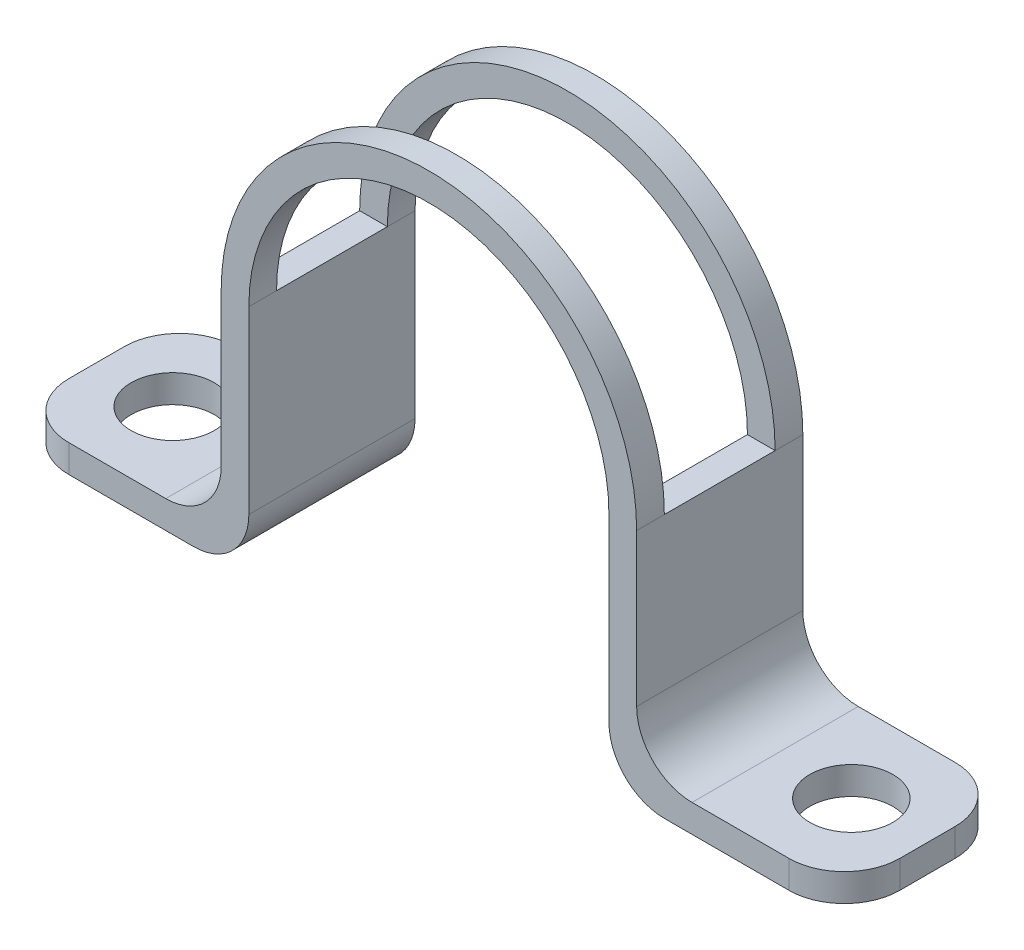
ISO-10303-21;
HEADER;
FILE_DESCRIPTION(('STEP AP214'),'2;1');
FILE_NAME('part.step','',(''),(''),'','','');
FILE_SCHEMA(('AUTOMOTIVE_DESIGN { 1 0 10303 214 1 1 1 1 }'));
ENDSEC;
DATA;
#1=APPLICATION_CONTEXT('core data for automotive mechanical design processes');
#2=APPLICATION_PROTOCOL_DEFINITION('international standard','automotive_design',2000,#1);
#3=PRODUCT_CONTEXT('',#1,'mechanical');
#4=PRODUCT('Part','Part','',(#3));
#5=PRODUCT_RELATED_PRODUCT_CATEGORY('part','',(#4));
#6=PRODUCT_DEFINITION_FORMATION('','',#4);
#7=PRODUCT_DEFINITION_CONTEXT('part definition',#1,'design');
#8=PRODUCT_DEFINITION('design','',#6,#7);
#9=PRODUCT_DEFINITION_SHAPE('','',#8);
#10=(LENGTH_UNIT() NAMED_UNIT(*) SI_UNIT(.MILLI.,.METRE.));
#11=(NAMED_UNIT(*) PLANE_ANGLE_UNIT() SI_UNIT($,.RADIAN.));
#12=(NAMED_UNIT(*) SI_UNIT($,.STERADIAN.) SOLID_ANGLE_UNIT());
#13=UNCERTAINTY_MEASURE_WITH_UNIT(LENGTH_MEASURE(1.E-05),#10,'distance_accuracy_value','');
#14=(GEOMETRIC_REPRESENTATION_CONTEXT(3) GLOBAL_UNCERTAINTY_ASSIGNED_CONTEXT((#13)) GLOBAL_UNIT_ASSIGNED_CONTEXT((#10,
#11,#12)) REPRESENTATION_CONTEXT('',''));
#15=CARTESIAN_POINT('',(0.,0.,0.));
#16=DIRECTION('',(0.,0.,1.));
#17=DIRECTION('',(1.,0.,0.));
#18=AXIS2_PLACEMENT_3D('',#15,#16,#17);
#19=CARTESIAN_POINT('',(0.,7.5,6.));
#20=DIRECTION('',(0.,0.,-1.));
#21=DIRECTION('',(-1.,0.,0.));
#22=AXIS2_PLACEMENT_3D('',#19,#20,#21);
#23=CYLINDRICAL_SURFACE('',#22,6.5);
#24=CARTESIAN_POINT('',(0.,7.5,5.));
#25=DIRECTION('',(0.,0.,-1.));
#26=DIRECTION('',(0.,1.,0.));
#27=AXIS2_PLACEMENT_3D('',#24,#25,#26);
#28=CIRCLE('',#27,6.5);
#29=CARTESIAN_POINT('',(6.5,7.5,5.));
#30=VERTEX_POINT('',#29);
#31=CARTESIAN_POINT('',(-6.5,7.5,5.));
#32=VERTEX_POINT('',#31);
#33=EDGE_CURVE('E489',#30,#32,#28,.F.);
#34=ORIENTED_EDGE('',*,*,#33,.F.);
#35=DIRECTION('',(0.,0.,-1.));
#36=VECTOR('',#35,1.);
#37=CARTESIAN_POINT('',(6.5,7.5,6.));
#38=LINE('',#37,#36);
#39=CARTESIAN_POINT('',(6.5,7.5,6.));
#40=VERTEX_POINT('',#39);
#41=EDGE_CURVE('E270',#40,#30,#38,.T.);
#42=ORIENTED_EDGE('',*,*,#41,.F.);
#43=CARTESIAN_POINT('',(0.,7.5,6.));
#44=DIRECTION('',(0.,0.,-1.));
#45=DIRECTION('',(1.,0.,0.));
#46=AXIS2_PLACEMENT_3D('',#43,#44,#45);
#47=CIRCLE('',#46,6.5);
#48=CARTESIAN_POINT('',(-6.5,7.5,6.));
#49=VERTEX_POINT('',#48);
#50=EDGE_CURVE('E470',#49,#40,#47,.T.);
#51=ORIENTED_EDGE('',*,*,#50,.F.);
#52=DIRECTION('',(0.,0.,-1.));
#53=VECTOR('',#52,1.);
#54=CARTESIAN_POINT('',(-6.5,7.5,6.));
#55=LINE('',#54,#53);
#56=EDGE_CURVE('E275',#49,#32,#55,.T.);
#57=ORIENTED_EDGE('',*,*,#56,.T.);
#58=EDGE_LOOP('',(#34,#42,#51,#57));
#59=FACE_BOUND('',#58,.T.);
#60=ADVANCED_FACE('F38',(#59),#23,.F.);
#61=CARTESIAN_POINT('',(0.,7.5,0.999999999999999));
#62=DIRECTION('',(0.,0.,1.));
#63=DIRECTION('',(1.,0.,0.));
#64=AXIS2_PLACEMENT_3D('',#61,#62,#63);
#65=CIRCLE('',#64,6.5);
#66=CARTESIAN_POINT('',(-6.5,7.5,0.999999999999999));
#67=VERTEX_POINT('',#66);
#68=CARTESIAN_POINT('',(6.5,7.5,0.999999999999999));
#69=VERTEX_POINT('',#68);
#70=EDGE_CURVE('E495',#67,#69,#65,.F.);
#71=ORIENTED_EDGE('',*,*,#70,.F.);
#72=CARTESIAN_POINT('',(-6.5,7.5,0.));
#73=VERTEX_POINT('',#72);
#74=EDGE_CURVE('E274',#67,#73,#55,.T.);
#75=ORIENTED_EDGE('',*,*,#74,.T.);
#76=CARTESIAN_POINT('',(0.,7.5,0.));
#77=DIRECTION('',(0.,0.,-1.));
#78=DIRECTION('',(1.,0.,0.));
#79=AXIS2_PLACEMENT_3D('',#76,#77,#78);
#80=CIRCLE('',#79,6.5);
#81=CARTESIAN_POINT('',(6.5,7.5,0.));
#82=VERTEX_POINT('',#81);
#83=EDGE_CURVE('E389',#73,#82,#80,.T.);
#84=ORIENTED_EDGE('',*,*,#83,.T.);
#85=EDGE_CURVE('E269',#69,#82,#38,.T.);
#86=ORIENTED_EDGE('',*,*,#85,.F.);
#87=EDGE_LOOP('',(#71,#75,#84,#86));
#88=FACE_BOUND('',#87,.T.);
#89=ADVANCED_FACE('F518',(#88),#23,.F.);
#90=CARTESIAN_POINT('',(0.,7.5,6.));
#91=DIRECTION('',(0.,0.,-1.));
#92=DIRECTION('',(-1.,0.,0.));
#93=AXIS2_PLACEMENT_3D('',#90,#91,#92);
#94=CYLINDRICAL_SURFACE('',#93,7.5);
#95=CARTESIAN_POINT('',(0.,7.5,5.));
#96=DIRECTION('',(0.,0.,-1.));
#97=DIRECTION('',(0.,1.,0.));
#98=AXIS2_PLACEMENT_3D('',#95,#96,#97);
#99=CIRCLE('',#98,7.5);
#100=CARTESIAN_POINT('',(-7.5,7.5,5.));
#101=VERTEX_POINT('',#100);
#102=CARTESIAN_POINT('',(7.5,7.5,5.));
#103=VERTEX_POINT('',#102);
#104=EDGE_CURVE('E201',#101,#103,#99,.T.);
#105=ORIENTED_EDGE('',*,*,#104,.F.);
#106=DIRECTION('',(0.,0.,-1.));
#107=VECTOR('',#106,1.);
#108=CARTESIAN_POINT('',(-7.5,7.5,6.));
#109=LINE('',#108,#107);
#110=CARTESIAN_POINT('',(-7.5,7.5,6.));
#111=VERTEX_POINT('',#110);
#112=EDGE_CURVE('E246',#111,#101,#109,.T.);
#113=ORIENTED_EDGE('',*,*,#112,.F.);
#114=CARTESIAN_POINT('',(0.,7.5,6.));
#115=DIRECTION('',(0.,0.,1.));
#116=DIRECTION('',(1.,0.,0.));
#117=AXIS2_PLACEMENT_3D('',#114,#115,#116);
#118=CIRCLE('',#117,7.5);
#119=CARTESIAN_POINT('',(7.5,7.5,6.));
#120=VERTEX_POINT('',#119);
#121=EDGE_CURVE('E237',#120,#111,#118,.T.);
#122=ORIENTED_EDGE('',*,*,#121,.F.);
#123=DIRECTION('',(0.,0.,-1.));
#124=VECTOR('',#123,1.);
#125=CARTESIAN_POINT('',(7.5,7.5,6.));
#126=LINE('',#125,#124);
#127=EDGE_CURVE('E231',#120,#103,#126,.T.);
#128=ORIENTED_EDGE('',*,*,#127,.T.);
#129=EDGE_LOOP('',(#105,#113,#122,#128));
#130=FACE_BOUND('',#129,.T.);
#131=ADVANCED_FACE('F236',(#130),#94,.T.);
#132=CARTESIAN_POINT('',(0.,7.5,0.999999999999999));
#133=DIRECTION('',(0.,0.,1.));
#134=DIRECTION('',(1.,0.,0.));
#135=AXIS2_PLACEMENT_3D('',#132,#133,#134);
#136=CIRCLE('',#135,7.5);
#137=CARTESIAN_POINT('',(7.5,7.5,0.999999999999999));
#138=VERTEX_POINT('',#137);
#139=CARTESIAN_POINT('',(-7.5,7.5,0.999999999999999));
#140=VERTEX_POINT('',#139);
#141=EDGE_CURVE('E214',#138,#140,#136,.T.);
#142=ORIENTED_EDGE('',*,*,#141,.F.);
#143=CARTESIAN_POINT('',(7.5,7.5,0.));
#144=VERTEX_POINT('',#143);
#145=EDGE_CURVE('E233',#138,#144,#126,.T.);
#146=ORIENTED_EDGE('',*,*,#145,.T.);
#147=CARTESIAN_POINT('',(0.,7.5,0.));
#148=DIRECTION('',(0.,0.,1.));
#149=DIRECTION('',(1.,0.,0.));
#150=AXIS2_PLACEMENT_3D('',#147,#148,#149);
#151=CIRCLE('',#150,7.5);
#152=CARTESIAN_POINT('',(-7.5,7.5,0.));
#153=VERTEX_POINT('',#152);
#154=EDGE_CURVE('E412',#144,#153,#151,.T.);
#155=ORIENTED_EDGE('',*,*,#154,.T.);
#156=EDGE_CURVE('E432',#140,#153,#109,.T.);
#157=ORIENTED_EDGE('',*,*,#156,.F.);
#158=EDGE_LOOP('',(#142,#146,#155,#157));
#159=FACE_BOUND('',#158,.T.);
#160=ADVANCED_FACE('F588',(#159),#94,.T.);
#161=CARTESIAN_POINT('',(-15.,-1.,6.));
#162=DIRECTION('',(1.,0.,0.));
#163=DIRECTION('',(0.,1.,0.));
#164=AXIS2_PLACEMENT_3D('',#161,#162,#163);
#165=PLANE('',#164);
#166=DIRECTION('',(0.,0.,-1.));
#167=VECTOR('',#166,1.);
#168=CARTESIAN_POINT('',(-15.,0.,6.));
#169=LINE('',#168,#167);
#170=CARTESIAN_POINT('',(-15.,0.,4.));
#171=VERTEX_POINT('',#170);
#172=CARTESIAN_POINT('',(-15.,0.,2.));
#173=VERTEX_POINT('',#172);
#174=EDGE_CURVE('E344',#171,#173,#169,.T.);
#175=ORIENTED_EDGE('',*,*,#174,.T.);
#176=DIRECTION('',(0.,-1.,0.));
#177=VECTOR('',#176,1.);
#178=CARTESIAN_POINT('',(-15.,-1.,2.));
#179=LINE('',#178,#177);
#180=CARTESIAN_POINT('',(-15.,-1.,2.));
#181=VERTEX_POINT('',#180);
#182=EDGE_CURVE('E328',#173,#181,#179,.T.);
#183=ORIENTED_EDGE('',*,*,#182,.T.);
#184=DIRECTION('',(0.,0.,-1.));
#185=VECTOR('',#184,1.);
#186=CARTESIAN_POINT('',(-15.,-1.,6.));
#187=LINE('',#186,#185);
#188=CARTESIAN_POINT('',(-15.,-1.,4.));
#189=VERTEX_POINT('',#188);
#190=EDGE_CURVE('E287',#189,#181,#187,.T.);
#191=ORIENTED_EDGE('',*,*,#190,.F.);
#192=DIRECTION('',(0.,-1.,0.));
#193=VECTOR('',#192,1.);
#194=CARTESIAN_POINT('',(-15.,0.,4.));
#195=LINE('',#194,#193);
#196=EDGE_CURVE('E59',#189,#171,#195,.F.);
#197=ORIENTED_EDGE('',*,*,#196,.T.);
#198=EDGE_LOOP('',(#175,#183,#191,#197));
#199=FACE_BOUND('',#198,.T.);
#200=ADVANCED_FACE('F360',(#199),#165,.F.);
#201=CARTESIAN_POINT('',(-8.50000000000001,-0.999999999999999,6.));
#202=DIRECTION('',(0.,1.,0.));
#203=DIRECTION('',(-1.,0.,0.));
#204=AXIS2_PLACEMENT_3D('',#201,#202,#203);
#205=PLANE('',#204);
#206=CARTESIAN_POINT('',(-12.25,-1.,3.));
#207=DIRECTION('',(0.,1.,0.));
#208=DIRECTION('',(-1.,0.,0.));
#209=AXIS2_PLACEMENT_3D('',#206,#207,#208);
#210=CIRCLE('',#209,1.5);
#211=CARTESIAN_POINT('',(-13.75,-1.,3.));
#212=VERTEX_POINT('',#211);
#213=EDGE_CURVE('E382',#212,#212,#210,.T.);
#214=ORIENTED_EDGE('',*,*,#213,.T.);
#215=EDGE_LOOP('',(#214));
#216=FACE_BOUND('',#215,.T.);
#217=ORIENTED_EDGE('',*,*,#190,.T.);
#218=CARTESIAN_POINT('',(-13.,-1.,2.));
#219=DIRECTION('',(0.,1.,0.));
#220=DIRECTION('',(-1.,0.,0.));
#221=AXIS2_PLACEMENT_3D('',#218,#219,#220);
#222=CIRCLE('',#221,2.);
#223=CARTESIAN_POINT('',(-13.,-1.,0.));
#224=VERTEX_POINT('',#223);
#225=EDGE_CURVE('E335',#181,#224,#222,.F.);
#226=ORIENTED_EDGE('',*,*,#225,.T.);
#227=DIRECTION('',(1.,0.,0.));
#228=VECTOR('',#227,1.);
#229=CARTESIAN_POINT('',(-8.50000000000001,-0.999999999999999,0.));
#230=LINE('',#229,#228);
#231=CARTESIAN_POINT('',(-8.50000000000001,-0.999999999999999,0.));
#232=VERTEX_POINT('',#231);
#233=EDGE_CURVE('E366',#224,#232,#230,.T.);
#234=ORIENTED_EDGE('',*,*,#233,.T.);
#235=DIRECTION('',(0.,0.,-1.));
#236=VECTOR('',#235,1.);
#237=CARTESIAN_POINT('',(-8.50000000000001,-0.999999999999999,6.));
#238=LINE('',#237,#236);
#239=CARTESIAN_POINT('',(-8.50000000000001,-0.999999999999999,6.));
#240=VERTEX_POINT('',#239);
#241=EDGE_CURVE('E283',#240,#232,#238,.T.);
#242=ORIENTED_EDGE('',*,*,#241,.F.);
#243=DIRECTION('',(1.,0.,0.));
#244=VECTOR('',#243,1.);
#245=CARTESIAN_POINT('',(-8.50000000000001,-0.999999999999999,6.));
#246=LINE('',#245,#244);
#247=CARTESIAN_POINT('',(-13.,-1.,6.));
#248=VERTEX_POINT('',#247);
#249=EDGE_CURVE('E359',#248,#240,#246,.T.);
#250=ORIENTED_EDGE('',*,*,#249,.F.);
#251=CARTESIAN_POINT('',(-13.,-1.,4.));
#252=DIRECTION('',(0.,1.,0.));
#253=DIRECTION('',(-1.,0.,0.));
#254=AXIS2_PLACEMENT_3D('',#251,#252,#253);
#255=CIRCLE('',#254,2.);
#256=EDGE_CURVE('E332',#248,#189,#255,.F.);
#257=ORIENTED_EDGE('',*,*,#256,.T.);
#258=EDGE_LOOP('',(#217,#226,#234,#242,#250,#257));
#259=FACE_BOUND('',#258,.T.);
#260=ADVANCED_FACE('F357',(#216,#259),#205,.F.);
#261=CARTESIAN_POINT('',(-8.5,1.,6.));
#262=DIRECTION('',(0.,0.,-1.));
#263=DIRECTION('',(-1.,0.,0.));
#264=AXIS2_PLACEMENT_3D('',#261,#262,#263);
#265=CYLINDRICAL_SURFACE('',#264,2.);
#266=CARTESIAN_POINT('',(-8.5,1.,0.));
#267=DIRECTION('',(0.,0.,1.));
#268=DIRECTION('',(-1.,0.,0.));
#269=AXIS2_PLACEMENT_3D('',#266,#267,#268);
#270=CIRCLE('',#269,2.);
#271=CARTESIAN_POINT('',(-6.5,1.00000000000002,0.));
#272=VERTEX_POINT('',#271);
#273=EDGE_CURVE('E373',#232,#272,#270,.T.);
#274=ORIENTED_EDGE('',*,*,#273,.T.);
#275=DIRECTION('',(0.,0.,-1.));
#276=VECTOR('',#275,1.);
#277=CARTESIAN_POINT('',(-6.5,1.00000000000002,6.));
#278=LINE('',#277,#276);
#279=CARTESIAN_POINT('',(-6.5,1.00000000000002,6.));
#280=VERTEX_POINT('',#279);
#281=EDGE_CURVE('E279',#280,#272,#278,.T.);
#282=ORIENTED_EDGE('',*,*,#281,.F.);
#283=CARTESIAN_POINT('',(-8.5,1.,6.));
#284=DIRECTION('',(0.,0.,1.));
#285=DIRECTION('',(-1.,0.,0.));
#286=AXIS2_PLACEMENT_3D('',#283,#284,#285);
#287=CIRCLE('',#286,2.);
#288=EDGE_CURVE('E476',#240,#280,#287,.T.);
#289=ORIENTED_EDGE('',*,*,#288,.F.);
#290=ORIENTED_EDGE('',*,*,#241,.T.);
#291=EDGE_LOOP('',(#274,#282,#289,#290));
#292=FACE_BOUND('',#291,.T.);
#293=ADVANCED_FACE('F547',(#292),#265,.T.);
#294=CARTESIAN_POINT('',(-6.5,7.5,6.));
#295=DIRECTION('',(-1.,0.,0.));
#296=DIRECTION('',(0.,-1.,0.));
#297=AXIS2_PLACEMENT_3D('',#294,#295,#296);
#298=PLANE('',#297);
#299=DIRECTION('',(0.,1.,0.));
#300=VECTOR('',#299,1.);
#301=CARTESIAN_POINT('',(-6.5,7.5,0.));
#302=LINE('',#301,#300);
#303=EDGE_CURVE('E379',#272,#73,#302,.T.);
#304=ORIENTED_EDGE('',*,*,#303,.T.);
#305=ORIENTED_EDGE('',*,*,#74,.F.);
#306=DIRECTION('',(0.,0.,-1.));
#307=VECTOR('',#306,1.);
#308=CARTESIAN_POINT('',(-6.5,7.5,6.));
#309=LINE('',#308,#307);
#310=EDGE_CURVE('E499',#32,#67,#309,.T.);
#311=ORIENTED_EDGE('',*,*,#310,.F.);
#312=ORIENTED_EDGE('',*,*,#56,.F.);
#313=DIRECTION('',(0.,1.,0.));
#314=VECTOR('',#313,1.);
#315=CARTESIAN_POINT('',(-6.5,7.5,6.));
#316=LINE('',#315,#314);
#317=EDGE_CURVE('E473',#280,#49,#316,.T.);
#318=ORIENTED_EDGE('',*,*,#317,.F.);
#319=ORIENTED_EDGE('',*,*,#281,.T.);
#320=EDGE_LOOP('',(#304,#305,#311,#312,#318,#319));
#321=FACE_BOUND('',#320,.T.);
#322=ADVANCED_FACE('F533',(#321),#298,.F.);
#323=CARTESIAN_POINT('',(6.5,7.5,6.));
#324=DIRECTION('',(1.,0.,0.));
#325=DIRECTION('',(0.,1.,0.));
#326=AXIS2_PLACEMENT_3D('',#323,#324,#325);
#327=PLANE('',#326);
#328=DIRECTION('',(0.,-1.,0.));
#329=VECTOR('',#328,1.);
#330=CARTESIAN_POINT('',(6.5,7.5,0.));
#331=LINE('',#330,#329);
#332=CARTESIAN_POINT('',(6.5,1.00000000000002,0.));
#333=VERTEX_POINT('',#332);
#334=EDGE_CURVE('E393',#82,#333,#331,.T.);
#335=ORIENTED_EDGE('',*,*,#334,.T.);
#336=DIRECTION('',(0.,0.,-1.));
#337=VECTOR('',#336,1.);
#338=CARTESIAN_POINT('',(6.5,1.00000000000002,6.));
#339=LINE('',#338,#337);
#340=CARTESIAN_POINT('',(6.5,1.00000000000002,6.));
#341=VERTEX_POINT('',#340);
#342=EDGE_CURVE('E265',#341,#333,#339,.T.);
#343=ORIENTED_EDGE('',*,*,#342,.F.);
#344=DIRECTION('',(0.,-1.,0.));
#345=VECTOR('',#344,1.);
#346=CARTESIAN_POINT('',(6.5,7.5,6.));
#347=LINE('',#346,#345);
#348=EDGE_CURVE('E467',#40,#341,#347,.T.);
#349=ORIENTED_EDGE('',*,*,#348,.F.);
#350=ORIENTED_EDGE('',*,*,#41,.T.);
#351=DIRECTION('',(0.,0.,1.));
#352=VECTOR('',#351,1.);
#353=CARTESIAN_POINT('',(6.5,7.5,6.));
#354=LINE('',#353,#352);
#355=EDGE_CURVE('E222',#69,#30,#354,.T.);
#356=ORIENTED_EDGE('',*,*,#355,.F.);
#357=ORIENTED_EDGE('',*,*,#85,.T.);
#358=EDGE_LOOP('',(#335,#343,#349,#350,#356,#357));
#359=FACE_BOUND('',#358,.T.);
#360=ADVANCED_FACE('F523',(#359),#327,.F.);
#361=CARTESIAN_POINT('',(8.5,1.,6.));
#362=DIRECTION('',(0.,0.,-1.));
#363=DIRECTION('',(-1.,0.,0.));
#364=AXIS2_PLACEMENT_3D('',#361,#362,#363);
#365=CYLINDRICAL_SURFACE('',#364,2.);
#366=CARTESIAN_POINT('',(8.5,1.,0.));
#367=DIRECTION('',(0.,0.,1.));
#368=DIRECTION('',(1.,0.,0.));
#369=AXIS2_PLACEMENT_3D('',#366,#367,#368);
#370=CIRCLE('',#369,2.);
#371=CARTESIAN_POINT('',(8.50000000000001,-0.999999999999999,0.));
#372=VERTEX_POINT('',#371);
#373=EDGE_CURVE('E396',#333,#372,#370,.T.);
#374=ORIENTED_EDGE('',*,*,#373,.T.);
#375=DIRECTION('',(0.,0.,-1.));
#376=VECTOR('',#375,1.);
#377=CARTESIAN_POINT('',(8.50000000000001,-0.999999999999999,6.));
#378=LINE('',#377,#376);
#379=CARTESIAN_POINT('',(8.50000000000001,-0.999999999999999,6.));
#380=VERTEX_POINT('',#379);
#381=EDGE_CURVE('E261',#380,#372,#378,.T.);
#382=ORIENTED_EDGE('',*,*,#381,.F.);
#383=CARTESIAN_POINT('',(8.5,1.,6.));
#384=DIRECTION('',(0.,0.,1.));
#385=DIRECTION('',(1.,0.,0.));
#386=AXIS2_PLACEMENT_3D('',#383,#384,#385);
#387=CIRCLE('',#386,2.);
#388=EDGE_CURVE('E464',#341,#380,#387,.T.);
#389=ORIENTED_EDGE('',*,*,#388,.F.);
#390=ORIENTED_EDGE('',*,*,#342,.T.);
#391=EDGE_LOOP('',(#374,#382,#389,#390));
#392=FACE_BOUND('',#391,.T.);
#393=ADVANCED_FACE('F541',(#392),#365,.T.);
#394=CARTESIAN_POINT('',(8.50000000000001,-0.999999999999999,6.));
#395=DIRECTION('',(0.,1.,0.));
#396=DIRECTION('',(-1.,0.,0.));
#397=AXIS2_PLACEMENT_3D('',#394,#395,#396);
#398=PLANE('',#397);
#399=CARTESIAN_POINT('',(12.25,-1.,3.));
#400=DIRECTION('',(0.,1.,0.));
#401=DIRECTION('',(-1.,0.,0.));
#402=AXIS2_PLACEMENT_3D('',#399,#400,#401);
#403=CIRCLE('',#402,1.5);
#404=CARTESIAN_POINT('',(10.75,-1.,3.));
#405=VERTEX_POINT('',#404);
#406=EDGE_CURVE('E375',#405,#405,#403,.T.);
#407=ORIENTED_EDGE('',*,*,#406,.T.);
#408=EDGE_LOOP('',(#407));
#409=FACE_BOUND('',#408,.T.);
#410=DIRECTION('',(1.,0.,0.));
#411=VECTOR('',#410,1.);
#412=CARTESIAN_POINT('',(8.50000000000001,-0.999999999999999,0.));
#413=LINE('',#412,#411);
#414=CARTESIAN_POINT('',(13.,-1.,0.));
#415=VERTEX_POINT('',#414);
#416=EDGE_CURVE('E399',#372,#415,#413,.T.);
#417=ORIENTED_EDGE('',*,*,#416,.T.);
#418=CARTESIAN_POINT('',(13.,-1.,2.));
#419=DIRECTION('',(0.,1.,0.));
#420=DIRECTION('',(-1.,0.,0.));
#421=AXIS2_PLACEMENT_3D('',#418,#419,#420);
#422=CIRCLE('',#421,2.);
#423=CARTESIAN_POINT('',(15.,-1.,2.));
#424=VERTEX_POINT('',#423);
#425=EDGE_CURVE('E315',#415,#424,#422,.F.);
#426=ORIENTED_EDGE('',*,*,#425,.T.);
#427=DIRECTION('',(0.,0.,-1.));
#428=VECTOR('',#427,1.);
#429=CARTESIAN_POINT('',(15.,-1.,6.));
#430=LINE('',#429,#428);
#431=CARTESIAN_POINT('',(15.,-1.,4.));
#432=VERTEX_POINT('',#431);
#433=EDGE_CURVE('E257',#432,#424,#430,.T.);
#434=ORIENTED_EDGE('',*,*,#433,.F.);
#435=CARTESIAN_POINT('',(13.,-1.,4.));
#436=DIRECTION('',(0.,1.,0.));
#437=DIRECTION('',(-1.,0.,0.));
#438=AXIS2_PLACEMENT_3D('',#435,#436,#437);
#439=CIRCLE('',#438,2.);
#440=CARTESIAN_POINT('',(13.,-1.,6.));
#441=VERTEX_POINT('',#440);
#442=EDGE_CURVE('E312',#432,#441,#439,.F.);
#443=ORIENTED_EDGE('',*,*,#442,.T.);
#444=DIRECTION('',(1.,0.,0.));
#445=VECTOR('',#444,1.);
#446=CARTESIAN_POINT('',(8.50000000000001,-0.999999999999999,6.));
#447=LINE('',#446,#445);
#448=EDGE_CURVE('E461',#380,#441,#447,.T.);
#449=ORIENTED_EDGE('',*,*,#448,.F.);
#450=ORIENTED_EDGE('',*,*,#381,.T.);
#451=EDGE_LOOP('',(#417,#426,#434,#443,#449,#450));
#452=FACE_BOUND('',#451,.T.);
#453=ADVANCED_FACE('F568',(#409,#452),#398,.F.);
#454=CARTESIAN_POINT('',(15.,-1.,6.));
#455=DIRECTION('',(-1.,0.,0.));
#456=DIRECTION('',(0.,-1.,0.));
#457=AXIS2_PLACEMENT_3D('',#454,#455,#456);
#458=PLANE('',#457);
#459=ORIENTED_EDGE('',*,*,#433,.T.);
#460=DIRECTION('',(0.,1.,0.));
#461=VECTOR('',#460,1.);
#462=CARTESIAN_POINT('',(15.,-1.,2.));
#463=LINE('',#462,#461);
#464=CARTESIAN_POINT('',(15.,0.,2.));
#465=VERTEX_POINT('',#464);
#466=EDGE_CURVE('E296',#424,#465,#463,.T.);
#467=ORIENTED_EDGE('',*,*,#466,.T.);
#468=DIRECTION('',(0.,0.,-1.));
#469=VECTOR('',#468,1.);
#470=CARTESIAN_POINT('',(15.,0.,6.));
#471=LINE('',#470,#469);
#472=CARTESIAN_POINT('',(15.,0.,4.));
#473=VERTEX_POINT('',#472);
#474=EDGE_CURVE('E253',#473,#465,#471,.T.);
#475=ORIENTED_EDGE('',*,*,#474,.F.);
#476=DIRECTION('',(0.,1.,0.));
#477=VECTOR('',#476,1.);
#478=CARTESIAN_POINT('',(15.,-1.,4.));
#479=LINE('',#478,#477);
#480=EDGE_CURVE('E213',#473,#432,#479,.F.);
#481=ORIENTED_EDGE('',*,*,#480,.T.);
#482=EDGE_LOOP('',(#459,#467,#475,#481));
#483=FACE_BOUND('',#482,.T.);
#484=ADVANCED_FACE('F571',(#483),#458,.F.);
#485=CARTESIAN_POINT('',(15.,0.,6.));
#486=DIRECTION('',(0.,-1.,0.));
#487=DIRECTION('',(0.,0.,-1.));
#488=AXIS2_PLACEMENT_3D('',#485,#486,#487);
#489=PLANE('',#488);
#490=CARTESIAN_POINT('',(12.25,0.,3.));
#491=DIRECTION('',(0.,1.,0.));
#492=DIRECTION('',(0.,0.,1.));
#493=AXIS2_PLACEMENT_3D('',#490,#491,#492);
#494=CIRCLE('',#493,1.5);
#495=CARTESIAN_POINT('',(12.25,0.,4.5));
#496=VERTEX_POINT('',#495);
#497=EDGE_CURVE('E484',#496,#496,#494,.T.);
#498=ORIENTED_EDGE('',*,*,#497,.F.);
#499=EDGE_LOOP('',(#498));
#500=FACE_BOUND('',#499,.T.);
#501=ORIENTED_EDGE('',*,*,#474,.T.);
#502=CARTESIAN_POINT('',(13.,0.,2.));
#503=DIRECTION('',(0.,-1.,0.));
#504=DIRECTION('',(0.,0.,-1.));
#505=AXIS2_PLACEMENT_3D('',#502,#503,#504);
#506=CIRCLE('',#505,2.);
#507=CARTESIAN_POINT('',(13.,0.,0.));
#508=VERTEX_POINT('',#507);
#509=EDGE_CURVE('E303',#465,#508,#506,.F.);
#510=ORIENTED_EDGE('',*,*,#509,.T.);
#511=DIRECTION('',(-1.,0.,0.));
#512=VECTOR('',#511,1.);
#513=CARTESIAN_POINT('',(15.,0.,0.));
#514=LINE('',#513,#512);
#515=CARTESIAN_POINT('',(9.50000000000001,0.,0.));
#516=VERTEX_POINT('',#515);
#517=EDGE_CURVE('E403',#508,#516,#514,.T.);
#518=ORIENTED_EDGE('',*,*,#517,.T.);
#519=DIRECTION('',(0.,0.,-1.));
#520=VECTOR('',#519,1.);
#521=CARTESIAN_POINT('',(9.50000000000001,0.,6.));
#522=LINE('',#521,#520);
#523=CARTESIAN_POINT('',(9.50000000000001,0.,6.));
#524=VERTEX_POINT('',#523);
#525=EDGE_CURVE('E244',#524,#516,#522,.T.);
#526=ORIENTED_EDGE('',*,*,#525,.F.);
#527=DIRECTION('',(-1.,0.,0.));
#528=VECTOR('',#527,1.);
#529=CARTESIAN_POINT('',(15.,0.,6.));
#530=LINE('',#529,#528);
#531=CARTESIAN_POINT('',(13.,0.,6.));
#532=VERTEX_POINT('',#531);
#533=EDGE_CURVE('E458',#532,#524,#530,.T.);
#534=ORIENTED_EDGE('',*,*,#533,.F.);
#535=CARTESIAN_POINT('',(13.,0.,4.));
#536=DIRECTION('',(0.,-1.,0.));
#537=DIRECTION('',(0.,0.,-1.));
#538=AXIS2_PLACEMENT_3D('',#535,#536,#537);
#539=CIRCLE('',#538,2.);
#540=EDGE_CURVE('E300',#532,#473,#539,.F.);
#541=ORIENTED_EDGE('',*,*,#540,.T.);
#542=EDGE_LOOP('',(#501,#510,#518,#526,#534,#541));
#543=FACE_BOUND('',#542,.T.);
#544=ADVANCED_FACE('F575',(#500,#543),#489,.F.);
#545=CARTESIAN_POINT('',(9.5,2.,6.));
#546=DIRECTION('',(0.,0.,-1.));
#547=DIRECTION('',(-1.,0.,0.));
#548=AXIS2_PLACEMENT_3D('',#545,#546,#547);
#549=CYLINDRICAL_SURFACE('',#548,2.);
#550=CARTESIAN_POINT('',(9.5,2.,0.));
#551=DIRECTION('',(0.,0.,-1.));
#552=DIRECTION('',(-1.,0.,0.));
#553=AXIS2_PLACEMENT_3D('',#550,#551,#552);
#554=CIRCLE('',#553,2.);
#555=CARTESIAN_POINT('',(7.5,2.00000000000001,0.));
#556=VERTEX_POINT('',#555);
#557=EDGE_CURVE('E406',#516,#556,#554,.T.);
#558=ORIENTED_EDGE('',*,*,#557,.T.);
#559=DIRECTION('',(0.,0.,-1.));
#560=VECTOR('',#559,1.);
#561=CARTESIAN_POINT('',(7.5,2.00000000000001,6.));
#562=LINE('',#561,#560);
#563=CARTESIAN_POINT('',(7.5,2.00000000000001,6.));
#564=VERTEX_POINT('',#563);
#565=EDGE_CURVE('E239',#564,#556,#562,.T.);
#566=ORIENTED_EDGE('',*,*,#565,.F.);
#567=CARTESIAN_POINT('',(9.5,2.,6.));
#568=DIRECTION('',(0.,0.,-1.));
#569=DIRECTION('',(-1.,0.,0.));
#570=AXIS2_PLACEMENT_3D('',#567,#568,#569);
#571=CIRCLE('',#570,2.);
#572=EDGE_CURVE('E455',#524,#564,#571,.T.);
#573=ORIENTED_EDGE('',*,*,#572,.F.);
#574=ORIENTED_EDGE('',*,*,#525,.T.);
#575=EDGE_LOOP('',(#558,#566,#573,#574));
#576=FACE_BOUND('',#575,.T.);
#577=ADVANCED_FACE('F579',(#576),#549,.F.);
#578=CARTESIAN_POINT('',(7.5,2.00000000000001,6.));
#579=DIRECTION('',(-1.,0.,0.));
#580=DIRECTION('',(0.,-1.,0.));
#581=AXIS2_PLACEMENT_3D('',#578,#579,#580);
#582=PLANE('',#581);
#583=DIRECTION('',(0.,1.,0.));
#584=VECTOR('',#583,1.);
#585=CARTESIAN_POINT('',(7.5,2.00000000000001,0.));
#586=LINE('',#585,#584);
#587=EDGE_CURVE('E409',#556,#144,#586,.T.);
#588=ORIENTED_EDGE('',*,*,#587,.T.);
#589=ORIENTED_EDGE('',*,*,#145,.F.);
#590=DIRECTION('',(0.,0.,-1.));
#591=VECTOR('',#590,1.);
#592=CARTESIAN_POINT('',(7.5,7.5,6.));
#593=LINE('',#592,#591);
#594=EDGE_CURVE('E219',#103,#138,#593,.T.);
#595=ORIENTED_EDGE('',*,*,#594,.F.);
#596=ORIENTED_EDGE('',*,*,#127,.F.);
#597=DIRECTION('',(0.,1.,0.));
#598=VECTOR('',#597,1.);
#599=CARTESIAN_POINT('',(7.5,2.00000000000001,6.));
#600=LINE('',#599,#598);
#601=EDGE_CURVE('E450',#564,#120,#600,.T.);
#602=ORIENTED_EDGE('',*,*,#601,.F.);
#603=ORIENTED_EDGE('',*,*,#565,.T.);
#604=EDGE_LOOP('',(#588,#589,#595,#596,#602,#603));
#605=FACE_BOUND('',#604,.T.);
#606=ADVANCED_FACE('F229',(#605),#582,.F.);
#607=CARTESIAN_POINT('',(-7.5,2.00000000000001,6.));
#608=DIRECTION('',(1.,0.,0.));
#609=DIRECTION('',(0.,1.,0.));
#610=AXIS2_PLACEMENT_3D('',#607,#608,#609);
#611=PLANE('',#610);
#612=DIRECTION('',(0.,-1.,0.));
#613=VECTOR('',#612,1.);
#614=CARTESIAN_POINT('',(-7.5,2.00000000000001,0.));
#615=LINE('',#614,#613);
#616=CARTESIAN_POINT('',(-7.5,2.,0.));
#617=VERTEX_POINT('',#616);
#618=EDGE_CURVE('E416',#153,#617,#615,.T.);
#619=ORIENTED_EDGE('',*,*,#618,.T.);
#620=DIRECTION('',(0.,0.,-1.));
#621=VECTOR('',#620,1.);
#622=CARTESIAN_POINT('',(-7.5,2.,6.));
#623=LINE('',#622,#621);
#624=CARTESIAN_POINT('',(-7.5,2.,6.));
#625=VERTEX_POINT('',#624);
#626=EDGE_CURVE('E429',#625,#617,#623,.T.);
#627=ORIENTED_EDGE('',*,*,#626,.F.);
#628=DIRECTION('',(0.,-1.,0.));
#629=VECTOR('',#628,1.);
#630=CARTESIAN_POINT('',(-7.5,2.00000000000001,6.));
#631=LINE('',#630,#629);
#632=EDGE_CURVE('E445',#111,#625,#631,.T.);
#633=ORIENTED_EDGE('',*,*,#632,.F.);
#634=ORIENTED_EDGE('',*,*,#112,.T.);
#635=EDGE_CURVE('E437',#101,#140,#109,.T.);
#636=ORIENTED_EDGE('',*,*,#635,.T.);
#637=ORIENTED_EDGE('',*,*,#156,.T.);
#638=EDGE_LOOP('',(#619,#627,#633,#634,#636,#637));
#639=FACE_BOUND('',#638,.T.);
#640=ADVANCED_FACE('F444',(#639),#611,.F.);
#641=CARTESIAN_POINT('',(-9.5,2.,6.));
#642=DIRECTION('',(0.,0.,-1.));
#643=DIRECTION('',(-1.,0.,0.));
#644=AXIS2_PLACEMENT_3D('',#641,#642,#643);
#645=CYLINDRICAL_SURFACE('',#644,2.);
#646=CARTESIAN_POINT('',(-9.5,2.,0.));
#647=DIRECTION('',(0.,0.,-1.));
#648=DIRECTION('',(1.,0.,0.));
#649=AXIS2_PLACEMENT_3D('',#646,#647,#648);
#650=CIRCLE('',#649,2.);
#651=CARTESIAN_POINT('',(-9.50000000000001,0.,0.));
#652=VERTEX_POINT('',#651);
#653=EDGE_CURVE('E419',#617,#652,#650,.T.);
#654=ORIENTED_EDGE('',*,*,#653,.T.);
#655=DIRECTION('',(0.,0.,-1.));
#656=VECTOR('',#655,1.);
#657=CARTESIAN_POINT('',(-9.50000000000001,0.,6.));
#658=LINE('',#657,#656);
#659=CARTESIAN_POINT('',(-9.50000000000001,0.,6.));
#660=VERTEX_POINT('',#659);
#661=EDGE_CURVE('E427',#660,#652,#658,.T.);
#662=ORIENTED_EDGE('',*,*,#661,.F.);
#663=CARTESIAN_POINT('',(-9.5,2.,6.));
#664=DIRECTION('',(0.,0.,-1.));
#665=DIRECTION('',(1.,0.,0.));
#666=AXIS2_PLACEMENT_3D('',#663,#664,#665);
#667=CIRCLE('',#666,2.);
#668=EDGE_CURVE('E352',#625,#660,#667,.T.);
#669=ORIENTED_EDGE('',*,*,#668,.F.);
#670=ORIENTED_EDGE('',*,*,#626,.T.);
#671=EDGE_LOOP('',(#654,#662,#669,#670));
#672=FACE_BOUND('',#671,.T.);
#673=ADVANCED_FACE('F591',(#672),#645,.F.);
#674=CARTESIAN_POINT('',(-15.,0.,6.));
#675=DIRECTION('',(0.,-1.,0.));
#676=DIRECTION('',(0.,0.,-1.));
#677=AXIS2_PLACEMENT_3D('',#674,#675,#676);
#678=PLANE('',#677);
#679=CARTESIAN_POINT('',(-12.25,0.,3.));
#680=DIRECTION('',(0.,1.,0.));
#681=DIRECTION('',(0.,0.,-1.));
#682=AXIS2_PLACEMENT_3D('',#679,#680,#681);
#683=CIRCLE('',#682,1.5);
#684=CARTESIAN_POINT('',(-12.25,0.,1.5));
#685=VERTEX_POINT('',#684);
#686=EDGE_CURVE('E485',#685,#685,#683,.T.);
#687=ORIENTED_EDGE('',*,*,#686,.F.);
#688=EDGE_LOOP('',(#687));
#689=FACE_BOUND('',#688,.T.);
#690=DIRECTION('',(-1.,0.,0.));
#691=VECTOR('',#690,1.);
#692=CARTESIAN_POINT('',(-15.,0.,0.));
#693=LINE('',#692,#691);
#694=CARTESIAN_POINT('',(-13.,0.,0.));
#695=VERTEX_POINT('',#694);
#696=EDGE_CURVE('E422',#652,#695,#693,.T.);
#697=ORIENTED_EDGE('',*,*,#696,.T.);
#698=CARTESIAN_POINT('',(-13.,0.,2.));
#699=DIRECTION('',(0.,-1.,0.));
#700=DIRECTION('',(0.,0.,-1.));
#701=AXIS2_PLACEMENT_3D('',#698,#699,#700);
#702=CIRCLE('',#701,2.);
#703=EDGE_CURVE('E11',#695,#173,#702,.F.);
#704=ORIENTED_EDGE('',*,*,#703,.T.);
#705=ORIENTED_EDGE('',*,*,#174,.F.);
#706=CARTESIAN_POINT('',(-13.,0.,4.));
#707=DIRECTION('',(0.,-1.,0.));
#708=DIRECTION('',(0.,0.,-1.));
#709=AXIS2_PLACEMENT_3D('',#706,#707,#708);
#710=CIRCLE('',#709,2.);
#711=CARTESIAN_POINT('',(-13.,0.,6.));
#712=VERTEX_POINT('',#711);
#713=EDGE_CURVE('E47',#171,#712,#710,.F.);
#714=ORIENTED_EDGE('',*,*,#713,.T.);
#715=DIRECTION('',(-1.,0.,0.));
#716=VECTOR('',#715,1.);
#717=CARTESIAN_POINT('',(-15.,0.,6.));
#718=LINE('',#717,#716);
#719=EDGE_CURVE('E343',#660,#712,#718,.T.);
#720=ORIENTED_EDGE('',*,*,#719,.F.);
#721=ORIENTED_EDGE('',*,*,#661,.T.);
#722=EDGE_LOOP('',(#697,#704,#705,#714,#720,#721));
#723=FACE_BOUND('',#722,.T.);
#724=ADVANCED_FACE('F341',(#689,#723),#678,.F.);
#725=CARTESIAN_POINT('',(-9.5,2.,6.));
#726=DIRECTION('',(0.,0.,1.));
#727=DIRECTION('',(1.,0.,0.));
#728=AXIS2_PLACEMENT_3D('',#725,#726,#727);
#729=PLANE('',#728);
#730=ORIENTED_EDGE('',*,*,#448,.T.);
#731=DIRECTION('',(0.,1.,0.));
#732=VECTOR('',#731,1.);
#733=CARTESIAN_POINT('',(13.,0.,6.));
#734=LINE('',#733,#732);
#735=EDGE_CURVE('E322',#441,#532,#734,.T.);
#736=ORIENTED_EDGE('',*,*,#735,.T.);
#737=ORIENTED_EDGE('',*,*,#533,.T.);
#738=ORIENTED_EDGE('',*,*,#572,.T.);
#739=ORIENTED_EDGE('',*,*,#601,.T.);
#740=ORIENTED_EDGE('',*,*,#121,.T.);
#741=ORIENTED_EDGE('',*,*,#632,.T.);
#742=ORIENTED_EDGE('',*,*,#668,.T.);
#743=ORIENTED_EDGE('',*,*,#719,.T.);
#744=DIRECTION('',(0.,-1.,0.));
#745=VECTOR('',#744,1.);
#746=CARTESIAN_POINT('',(-13.,-1.,6.));
#747=LINE('',#746,#745);
#748=EDGE_CURVE('E318',#712,#248,#747,.T.);
#749=ORIENTED_EDGE('',*,*,#748,.T.);
#750=ORIENTED_EDGE('',*,*,#249,.T.);
#751=ORIENTED_EDGE('',*,*,#288,.T.);
#752=ORIENTED_EDGE('',*,*,#317,.T.);
#753=ORIENTED_EDGE('',*,*,#50,.T.);
#754=ORIENTED_EDGE('',*,*,#348,.T.);
#755=ORIENTED_EDGE('',*,*,#388,.T.);
#756=EDGE_LOOP('',(#730,#736,#737,#738,#739,#740,#741,#742,#743,#749,#750,#751,#752,#753,#754,#755));
#757=FACE_BOUND('',#756,.T.);
#758=ADVANCED_FACE('F349',(#757),#729,.T.);
#759=CARTESIAN_POINT('',(-9.5,2.,0.));
#760=DIRECTION('',(0.,0.,1.));
#761=DIRECTION('',(1.,0.,0.));
#762=AXIS2_PLACEMENT_3D('',#759,#760,#761);
#763=PLANE('',#762);
#764=ORIENTED_EDGE('',*,*,#517,.F.);
#765=DIRECTION('',(0.,1.,0.));
#766=VECTOR('',#765,1.);
#767=CARTESIAN_POINT('',(13.,2.00000000000004,0.));
#768=LINE('',#767,#766);
#769=EDGE_CURVE('E309',#508,#415,#768,.F.);
#770=ORIENTED_EDGE('',*,*,#769,.T.);
#771=ORIENTED_EDGE('',*,*,#416,.F.);
#772=ORIENTED_EDGE('',*,*,#373,.F.);
#773=ORIENTED_EDGE('',*,*,#334,.F.);
#774=ORIENTED_EDGE('',*,*,#83,.F.);
#775=ORIENTED_EDGE('',*,*,#303,.F.);
#776=ORIENTED_EDGE('',*,*,#273,.F.);
#777=ORIENTED_EDGE('',*,*,#233,.F.);
#778=DIRECTION('',(0.,-1.,0.));
#779=VECTOR('',#778,1.);
#780=CARTESIAN_POINT('',(-13.,2.00000000000001,0.));
#781=LINE('',#780,#779);
#782=EDGE_CURVE('E306',#224,#695,#781,.F.);
#783=ORIENTED_EDGE('',*,*,#782,.T.);
#784=ORIENTED_EDGE('',*,*,#696,.F.);
#785=ORIENTED_EDGE('',*,*,#653,.F.);
#786=ORIENTED_EDGE('',*,*,#618,.F.);
#787=ORIENTED_EDGE('',*,*,#154,.F.);
#788=ORIENTED_EDGE('',*,*,#587,.F.);
#789=ORIENTED_EDGE('',*,*,#557,.F.);
#790=EDGE_LOOP('',(#764,#770,#771,#772,#773,#774,#775,#776,#777,#783,#784,#785,#786,#787,#788,#789));
#791=FACE_BOUND('',#790,.T.);
#792=ADVANCED_FACE('F370',(#791),#763,.F.);
#793=CARTESIAN_POINT('',(-12.25,-6.,3.));
#794=DIRECTION('',(0.,1.,0.));
#795=DIRECTION('',(0.,0.,1.));
#796=AXIS2_PLACEMENT_3D('',#793,#794,#795);
#797=CYLINDRICAL_SURFACE('',#796,1.5);
#798=ORIENTED_EDGE('',*,*,#686,.T.);
#799=EDGE_LOOP('',(#798));
#800=FACE_BOUND('',#799,.T.);
#801=ORIENTED_EDGE('',*,*,#213,.F.);
#802=EDGE_LOOP('',(#801));
#803=FACE_BOUND('',#802,.T.);
#804=ADVANCED_FACE('F599',(#800,#803),#797,.F.);
#805=CARTESIAN_POINT('',(12.25,-6.,3.));
#806=DIRECTION('',(0.,1.,0.));
#807=DIRECTION('',(0.,0.,1.));
#808=AXIS2_PLACEMENT_3D('',#805,#806,#807);
#809=CYLINDRICAL_SURFACE('',#808,1.5);
#810=ORIENTED_EDGE('',*,*,#497,.T.);
#811=EDGE_LOOP('',(#810));
#812=FACE_BOUND('',#811,.T.);
#813=ORIENTED_EDGE('',*,*,#406,.F.);
#814=EDGE_LOOP('',(#813));
#815=FACE_BOUND('',#814,.T.);
#816=ADVANCED_FACE('F604',(#812,#815),#809,.F.);
#817=CARTESIAN_POINT('',(12.,17.5,5.));
#818=DIRECTION('',(0.,0.,-1.));
#819=DIRECTION('',(0.,1.,0.));
#820=AXIS2_PLACEMENT_3D('',#817,#818,#819);
#821=PLANE('',#820);
#822=ORIENTED_EDGE('',*,*,#33,.T.);
#823=DIRECTION('',(-1.,0.,0.));
#824=VECTOR('',#823,1.);
#825=CARTESIAN_POINT('',(12.,7.5,5.));
#826=LINE('',#825,#824);
#827=EDGE_CURVE('E207',#32,#101,#826,.T.);
#828=ORIENTED_EDGE('',*,*,#827,.T.);
#829=ORIENTED_EDGE('',*,*,#104,.T.);
#830=EDGE_CURVE('E204',#103,#30,#826,.T.);
#831=ORIENTED_EDGE('',*,*,#830,.T.);
#832=EDGE_LOOP('',(#822,#828,#829,#831));
#833=FACE_BOUND('',#832,.T.);
#834=ADVANCED_FACE('F203',(#833),#821,.T.);
#835=CARTESIAN_POINT('',(12.,7.5,0.999999999999999));
#836=DIRECTION('',(0.,0.,1.));
#837=DIRECTION('',(1.,0.,0.));
#838=AXIS2_PLACEMENT_3D('',#835,#836,#837);
#839=PLANE('',#838);
#840=ORIENTED_EDGE('',*,*,#70,.T.);
#841=DIRECTION('',(-1.,0.,0.));
#842=VECTOR('',#841,1.);
#843=CARTESIAN_POINT('',(12.,7.5,0.999999999999999));
#844=LINE('',#843,#842);
#845=EDGE_CURVE('E505',#138,#69,#844,.T.);
#846=ORIENTED_EDGE('',*,*,#845,.F.);
#847=ORIENTED_EDGE('',*,*,#141,.T.);
#848=EDGE_CURVE('E506',#67,#140,#844,.T.);
#849=ORIENTED_EDGE('',*,*,#848,.F.);
#850=EDGE_LOOP('',(#840,#846,#847,#849));
#851=FACE_BOUND('',#850,.T.);
#852=ADVANCED_FACE('F515',(#851),#839,.T.);
#853=CARTESIAN_POINT('',(12.,7.5,5.));
#854=DIRECTION('',(0.,1.,0.));
#855=DIRECTION('',(0.,0.,1.));
#856=AXIS2_PLACEMENT_3D('',#853,#854,#855);
#857=PLANE('',#856);
#858=ORIENTED_EDGE('',*,*,#310,.T.);
#859=ORIENTED_EDGE('',*,*,#848,.T.);
#860=ORIENTED_EDGE('',*,*,#635,.F.);
#861=ORIENTED_EDGE('',*,*,#827,.F.);
#862=EDGE_LOOP('',(#858,#859,#860,#861));
#863=FACE_BOUND('',#862,.T.);
#864=ADVANCED_FACE('F531',(#863),#857,.T.);
#865=ORIENTED_EDGE('',*,*,#355,.T.);
#866=ORIENTED_EDGE('',*,*,#830,.F.);
#867=ORIENTED_EDGE('',*,*,#594,.T.);
#868=ORIENTED_EDGE('',*,*,#845,.T.);
#869=EDGE_LOOP('',(#865,#866,#867,#868));
#870=FACE_BOUND('',#869,.T.);
#871=ADVANCED_FACE('F218',(#870),#857,.T.);
#872=CARTESIAN_POINT('',(13.,-1.,2.));
#873=DIRECTION('',(0.,1.,0.));
#874=DIRECTION('',(-1.,0.,0.));
#875=AXIS2_PLACEMENT_3D('',#872,#873,#874);
#876=CYLINDRICAL_SURFACE('',#875,2.);
#877=ORIENTED_EDGE('',*,*,#425,.F.);
#878=ORIENTED_EDGE('',*,*,#769,.F.);
#879=ORIENTED_EDGE('',*,*,#509,.F.);
#880=ORIENTED_EDGE('',*,*,#466,.F.);
#881=EDGE_LOOP('',(#877,#878,#879,#880));
#882=FACE_BOUND('',#881,.T.);
#883=ADVANCED_FACE('F628',(#882),#876,.T.);
#884=CARTESIAN_POINT('',(13.,2.00000000000004,4.));
#885=DIRECTION('',(0.,-1.,0.));
#886=DIRECTION('',(1.,0.,0.));
#887=AXIS2_PLACEMENT_3D('',#884,#885,#886);
#888=CYLINDRICAL_SURFACE('',#887,2.);
#889=ORIENTED_EDGE('',*,*,#442,.F.);
#890=ORIENTED_EDGE('',*,*,#480,.F.);
#891=ORIENTED_EDGE('',*,*,#540,.F.);
#892=ORIENTED_EDGE('',*,*,#735,.F.);
#893=EDGE_LOOP('',(#889,#890,#891,#892));
#894=FACE_BOUND('',#893,.T.);
#895=ADVANCED_FACE('F635',(#894),#888,.T.);
#896=CARTESIAN_POINT('',(-13.,-1.,2.));
#897=DIRECTION('',(0.,-1.,0.));
#898=DIRECTION('',(1.,0.,0.));
#899=AXIS2_PLACEMENT_3D('',#896,#897,#898);
#900=CYLINDRICAL_SURFACE('',#899,2.);
#901=ORIENTED_EDGE('',*,*,#703,.F.);
#902=ORIENTED_EDGE('',*,*,#782,.F.);
#903=ORIENTED_EDGE('',*,*,#225,.F.);
#904=ORIENTED_EDGE('',*,*,#182,.F.);
#905=EDGE_LOOP('',(#901,#902,#903,#904));
#906=FACE_BOUND('',#905,.T.);
#907=ADVANCED_FACE('F363',(#906),#900,.T.);
#908=CARTESIAN_POINT('',(-13.,2.00000000000001,4.));
#909=DIRECTION('',(0.,1.,0.));
#910=DIRECTION('',(-1.,0.,0.));
#911=AXIS2_PLACEMENT_3D('',#908,#909,#910);
#912=CYLINDRICAL_SURFACE('',#911,2.);
#913=ORIENTED_EDGE('',*,*,#713,.F.);
#914=ORIENTED_EDGE('',*,*,#196,.F.);
#915=ORIENTED_EDGE('',*,*,#256,.F.);
#916=ORIENTED_EDGE('',*,*,#748,.F.);
#917=EDGE_LOOP('',(#913,#914,#915,#916));
#918=FACE_BOUND('',#917,.T.);
#919=ADVANCED_FACE('F40',(#918),#912,.T.);
#920=CLOSED_SHELL('',(#60,#89,#131,#160,#200,#260,#293,#322,#360,#393,#453,#484,#544,#577,#606,
#640,#673,#724,#758,#792,#804,#816,#834,#852,#864,#871,#883,#895,#907,#919));
#921=MANIFOLD_SOLID_BREP('B2',#920);
#922=ADVANCED_BREP_SHAPE_REPRESENTATION('',(#18,#921),#14);
#923=SHAPE_DEFINITION_REPRESENTATION(#9,#922);
ENDSEC;
END-ISO-10303-21;
